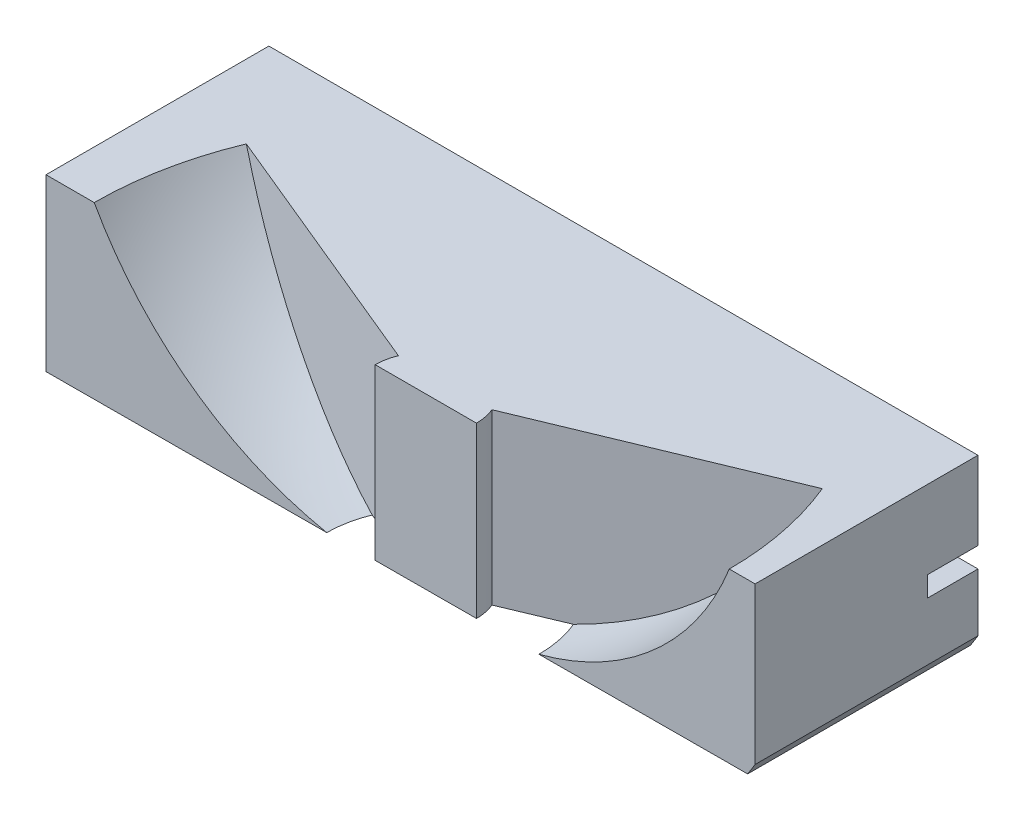
ISO-10303-21;
HEADER;
FILE_DESCRIPTION(('STEP AP214'),'2;1');
FILE_NAME('part.step','',(''),(''),'','','');
FILE_SCHEMA(('AUTOMOTIVE_DESIGN { 1 0 10303 214 1 1 1 1 }'));
ENDSEC;
DATA;
#1=APPLICATION_CONTEXT('core data for automotive mechanical design processes');
#2=APPLICATION_PROTOCOL_DEFINITION('international standard','automotive_design',2000,#1);
#3=PRODUCT_CONTEXT('',#1,'mechanical');
#4=PRODUCT('Part','Part','',(#3));
#5=PRODUCT_RELATED_PRODUCT_CATEGORY('part','',(#4));
#6=PRODUCT_DEFINITION_FORMATION('','',#4);
#7=PRODUCT_DEFINITION_CONTEXT('part definition',#1,'design');
#8=PRODUCT_DEFINITION('design','',#6,#7);
#9=PRODUCT_DEFINITION_SHAPE('','',#8);
#10=(LENGTH_UNIT() NAMED_UNIT(*) SI_UNIT(.MILLI.,.METRE.));
#11=(NAMED_UNIT(*) PLANE_ANGLE_UNIT() SI_UNIT($,.RADIAN.));
#12=(NAMED_UNIT(*) SI_UNIT($,.STERADIAN.) SOLID_ANGLE_UNIT());
#13=UNCERTAINTY_MEASURE_WITH_UNIT(LENGTH_MEASURE(1.E-05),#10,'distance_accuracy_value','');
#14=(GEOMETRIC_REPRESENTATION_CONTEXT(3) GLOBAL_UNCERTAINTY_ASSIGNED_CONTEXT((#13)) GLOBAL_UNIT_ASSIGNED_CONTEXT((#10,
#11,#12)) REPRESENTATION_CONTEXT('',''));
#15=CARTESIAN_POINT('',(0.,0.,0.));
#16=DIRECTION('',(0.,0.,1.));
#17=DIRECTION('',(1.,0.,0.));
#18=AXIS2_PLACEMENT_3D('',#15,#16,#17);
#19=CARTESIAN_POINT('',(-0.0573849535127821,16.6343068349976,0.));
#20=DIRECTION('',(0.00344977477050121,-0.999994049509312,0.));
#21=DIRECTION('',(0.999994049509312,0.00344977477050121,0.));
#22=AXIS2_PLACEMENT_3D('',#19,#20,#21);
#23=PLANE('',#22);
#24=DIRECTION('',(0.,0.,-1.));
#25=VECTOR('',#24,1.);
#26=CARTESIAN_POINT('',(-17.4999836629939,16.5741334399764,11.));
#27=LINE('',#26,#25);
#28=CARTESIAN_POINT('',(-17.4999836629939,16.5741334399764,0.));
#29=VERTEX_POINT('',#28);
#30=CARTESIAN_POINT('',(-17.4999836629939,16.5741334399764,-11.));
#31=VERTEX_POINT('',#30);
#32=EDGE_CURVE('E319',#29,#31,#27,.T.);
#33=ORIENTED_EDGE('',*,*,#32,.T.);
#34=DIRECTION('',(0.999994049509312,0.00344977477050121,0.));
#35=VECTOR('',#34,1.);
#36=CARTESIAN_POINT('',(-0.0530283972441789,16.6343218642249,-11.));
#37=LINE('',#36,#35);
#38=CARTESIAN_POINT('',(17.1297965112873,16.6935990928089,-11.));
#39=VERTEX_POINT('',#38);
#40=EDGE_CURVE('E190',#31,#39,#37,.T.);
#41=ORIENTED_EDGE('',*,*,#40,.T.);
#42=DIRECTION('',(0.,0.,1.));
#43=VECTOR('',#42,1.);
#44=CARTESIAN_POINT('',(17.1297965112873,16.6935990928089,-60.924766180902));
#45=LINE('',#44,#43);
#46=CARTESIAN_POINT('',(17.1297965112873,16.6935990928089,0.));
#47=VERTEX_POINT('',#46);
#48=EDGE_CURVE('E318',#39,#47,#45,.T.);
#49=ORIENTED_EDGE('',*,*,#48,.T.);
#50=DIRECTION('',(0.999994049509312,0.00344977477050121,0.));
#51=VECTOR('',#50,1.);
#52=CARTESIAN_POINT('',(-0.0530283972441789,16.6343218642249,0.));
#53=LINE('',#52,#51);
#54=CARTESIAN_POINT('',(6.82777060649413,16.6580592122778,0.));
#55=VERTEX_POINT('',#54);
#56=EDGE_CURVE('E175',#55,#47,#53,.T.);
#57=ORIENTED_EDGE('',*,*,#56,.F.);
#58=CARTESIAN_POINT('',(6.80962474678449,16.6579966127763,0.44690476985865));
#59=CARTESIAN_POINT('',(6.82236464578608,16.65804056282,0.290286915419516));
#60=CARTESIAN_POINT('',(6.82839702052645,16.658061373278,0.133200806205045));
#61=CARTESIAN_POINT('',(6.82704097165823,16.658056695187,-0.18090852850465));
#62=CARTESIAN_POINT('',(6.81965295811392,16.6580312080526,-0.337931755774619));
#63=CARTESIAN_POINT('',(6.77812994199541,16.6578879621468,-0.798769409113629));
#64=CARTESIAN_POINT('',(6.72532045909425,16.657705780241,-1.10111974995693));
#65=CARTESIAN_POINT('',(6.57508709752669,16.6571875058966,-1.67461766940396));
#66=CARTESIAN_POINT('',(6.48058193751898,16.6568614824399,-1.94654348884055));
#67=CARTESIAN_POINT('',(6.24760110178251,16.6560577462481,-2.47926027014327));
#68=CARTESIAN_POINT('',(6.10805314024972,16.6555763343465,-2.73958246318124));
#69=CARTESIAN_POINT('',(5.94828340197904,16.6550251614546,-2.98706014217391));
#70=B_SPLINE_CURVE_WITH_KNOTS('',3,(#58,#59,#60,#61,#62,#63,#64,#65,#66,#67,#68,#69),
.UNSPECIFIED.,.F.,.F.,(4,2,2,2,2,4),(0.,0.471108642622526,0.942202890611027,1.85834327293607,
2.71858587803662,3.60103931055067),.UNSPECIFIED.);
#71=CARTESIAN_POINT('',(6.39815124631617,16.6565771134289,-2.13350523914141));
#72=VERTEX_POINT('',#71);
#73=EDGE_CURVE('E297',#55,#72,#70,.T.);
#74=ORIENTED_EDGE('',*,*,#73,.T.);
#75=DIRECTION('',(-0.923874722162632,-0.00318717867289747,0.382681773332657));
#76=VECTOR('',#75,1.);
#77=CARTESIAN_POINT('',(3.19642231795104,16.6455318040248,-0.807304538283233));
#78=LINE('',#77,#76);
#79=CARTESIAN_POINT('',(3.55710431889961,16.6467445999911,-0.956704078544097));
#80=VERTEX_POINT('',#79);
#81=EDGE_CURVE('E281',#72,#80,#78,.T.);
#82=ORIENTED_EDGE('',*,*,#81,.T.);
#83=CARTESIAN_POINT('',(3.5571052287099,16.6467760862346,-0.95670450038757));
#84=CARTESIAN_POINT('',(3.74740357485177,16.6474325765744,-0.497278622709659));
#85=CARTESIAN_POINT('',(3.74740357485177,16.6474325765744,0.));
#86=B_SPLINE_CURVE_WITH_KNOTS('',2,(#83,#84,#85),.UNSPECIFIED.,.F.,.F.,(3,3),(0.,1.),.UNSPECIFIED.);
#87=CARTESIAN_POINT('',(3.74740357485177,16.6474325765744,0.));
#88=VERTEX_POINT('',#87);
#89=EDGE_CURVE('E274',#80,#88,#86,.T.);
#90=ORIENTED_EDGE('',*,*,#89,.T.);
#91=DIRECTION('',(0.999994049509312,0.00344977477050121,0.));
#92=VECTOR('',#91,1.);
#93=CARTESIAN_POINT('',(-0.0530283972441789,16.6343218642249,0.));
#94=LINE('',#93,#92);
#95=CARTESIAN_POINT('',(-1.25256449414034,16.6301837102375,0.));
#96=VERTEX_POINT('',#95);
#97=EDGE_CURVE('E178',#96,#88,#94,.T.);
#98=ORIENTED_EDGE('',*,*,#97,.F.);
#99=CARTESIAN_POINT('',(-1.25256667269479,16.6301837027219,0.));
#100=CARTESIAN_POINT('',(-1.25256667269479,16.6301837027219,-0.497278556436228));
#101=CARTESIAN_POINT('',(-1.06226837534537,16.6308401928934,-0.956704382590863));
#102=B_SPLINE_CURVE_WITH_KNOTS('',2,(#99,#100,#101),.UNSPECIFIED.,.F.,.F.,(3,3),(0.,1.),.UNSPECIFIED.);
#103=CARTESIAN_POINT('',(-1.06226742638805,16.6308176811921,-0.956704021692015));
#104=VERTEX_POINT('',#103);
#105=EDGE_CURVE('E271',#96,#104,#102,.T.);
#106=ORIENTED_EDGE('',*,*,#105,.T.);
#107=DIRECTION('',(-0.923874722162632,-0.00318717867289749,-0.382681773332657));
#108=VECTOR('',#107,1.);
#109=CARTESIAN_POINT('',(-0.171640886993569,16.6339126754155,-0.587794135861235));
#110=LINE('',#109,#108);
#111=CARTESIAN_POINT('',(-3.27502998855942,16.6232066182835,-1.87326111124126));
#112=VERTEX_POINT('',#111);
#113=EDGE_CURVE('E177',#104,#112,#110,.T.);
#114=ORIENTED_EDGE('',*,*,#113,.T.);
#115=CARTESIAN_POINT('',(-3.64014990689312,16.6219470293059,0.127401326466755));
#116=CARTESIAN_POINT('',(-3.64377015758628,16.6219345401821,-0.0138768940326821));
#117=CARTESIAN_POINT('',(-3.64136305428976,16.6219428441957,-0.155228514957291));
#118=CARTESIAN_POINT('',(-3.62452297030105,16.6220009390383,-0.437240287035578));
#119=CARTESIAN_POINT('',(-3.61008769921908,16.6220507377686,-0.577900301362626));
#120=CARTESIAN_POINT('',(-3.54976590862448,16.6222588355982,-0.990785072537782));
#121=CARTESIAN_POINT('',(-3.48702069452034,16.6224752937428,-1.26078388205942));
#122=CARTESIAN_POINT('',(-3.34612083236369,16.6229613694248,-1.69815580414729));
#123=CARTESIAN_POINT('',(-3.28016839681602,16.6231888918269,-1.86960999262592));
#124=CARTESIAN_POINT('',(-3.12856511824855,16.6237118921045,-2.20681124059305));
#125=CARTESIAN_POINT('',(-3.04262214711039,16.6240083777623,-2.37242698972255));
#126=CARTESIAN_POINT('',(-2.94756128857161,16.6243363182651,-2.53277808426929));
#127=B_SPLINE_CURVE_WITH_KNOTS('',3,(#115,#116,#117,#118,#119,#120,#121,#122,#123,#124,#125,
#126),.UNSPECIFIED.,.F.,.F.,(4,2,2,2,2,4),(0.,0.423683587060127,0.847447869899776,
1.67461972768066,2.22471103645234,2.78341131403662),.UNSPECIFIED.);
#128=CARTESIAN_POINT('',(-3.64178393435121,16.6219413922457,0.));
#129=VERTEX_POINT('',#128);
#130=EDGE_CURVE('E165',#129,#112,#127,.T.);
#131=ORIENTED_EDGE('',*,*,#130,.F.);
#132=EDGE_CURVE('E44',#29,#129,#53,.T.);
#133=ORIENTED_EDGE('',*,*,#132,.F.);
#134=EDGE_LOOP('',(#33,#41,#49,#57,#74,#82,#90,#98,#106,#114,#131,#133));
#135=FACE_BOUND('',#134,.T.);
#136=ADVANCED_FACE('F34',(#135),#23,.T.);
#137=CARTESIAN_POINT('',(-20.193762707854,21.1307270118031,-8.49999999999999));
#138=DIRECTION('',(0.,0.,1.));
#139=DIRECTION('',(0.999999965521372,0.000262597134505751,0.));
#140=AXIS2_PLACEMENT_3D('',#137,#138,#139);
#141=PLANE('',#140);
#142=DIRECTION('',(-0.00026259713450589,0.999999965521372,0.));
#143=VECTOR('',#142,1.);
#144=CARTESIAN_POINT('',(-17.5011803971233,21.1314340762267,-8.49999999999999));
#145=LINE('',#144,#143);
#146=CARTESIAN_POINT('',(-17.5009177999888,20.1314341107054,-8.49999999999999));
#147=VERTEX_POINT('',#146);
#148=CARTESIAN_POINT('',(-17.5011803971233,21.1314340762267,-8.49999999999999));
#149=VERTEX_POINT('',#148);
#150=EDGE_CURVE('E287',#147,#149,#145,.T.);
#151=ORIENTED_EDGE('',*,*,#150,.T.);
#152=DIRECTION('',(0.999999965521372,0.00026259713450589,0.));
#153=VECTOR('',#152,1.);
#154=CARTESIAN_POINT('',(-20.193762707854,21.1307270118031,-8.49999999999999));
#155=LINE('',#154,#153);
#156=CARTESIAN_POINT('',(17.4988183961247,21.1406249759345,-8.49999999999999));
#157=VERTEX_POINT('',#156);
#158=EDGE_CURVE('E356',#149,#157,#155,.T.);
#159=ORIENTED_EDGE('',*,*,#158,.T.);
#160=DIRECTION('',(0.000262597134505751,-0.999999965521372,0.));
#161=VECTOR('',#160,1.);
#162=CARTESIAN_POINT('',(17.4988183961247,21.1406249759345,-8.49999999999999));
#163=LINE('',#162,#161);
#164=CARTESIAN_POINT('',(17.4990809932592,20.1406250104131,-8.49999999999999));
#165=VERTEX_POINT('',#164);
#166=EDGE_CURVE('E358',#157,#165,#163,.T.);
#167=ORIENTED_EDGE('',*,*,#166,.T.);
#168=DIRECTION('',(0.999999965521372,0.00026259713450589,0.));
#169=VECTOR('',#168,1.);
#170=CARTESIAN_POINT('',(-20.1935001107195,20.1307270462818,-8.49999999999999));
#171=LINE('',#170,#169);
#172=EDGE_CURVE('E347',#147,#165,#171,.T.);
#173=ORIENTED_EDGE('',*,*,#172,.F.);
#174=EDGE_LOOP('',(#151,#159,#167,#173));
#175=FACE_BOUND('',#174,.T.);
#176=ADVANCED_FACE('F229',(#175),#141,.F.);
#177=CARTESIAN_POINT('',(-20.193762707854,21.1307270118031,-11.));
#178=DIRECTION('',(-0.00026259713450589,0.999999965521372,0.));
#179=DIRECTION('',(-0.999999965521372,-0.00026259713450589,0.));
#180=AXIS2_PLACEMENT_3D('',#177,#178,#179);
#181=PLANE('',#180);
#182=DIRECTION('',(0.,0.,-1.));
#183=VECTOR('',#182,1.);
#184=CARTESIAN_POINT('',(-17.5011803971233,21.1314340762267,-11.));
#185=LINE('',#184,#183);
#186=CARTESIAN_POINT('',(-17.5011803971233,21.1314340762267,-11.));
#187=VERTEX_POINT('',#186);
#188=EDGE_CURVE('E294',#149,#187,#185,.T.);
#189=ORIENTED_EDGE('',*,*,#188,.T.);
#190=DIRECTION('',(0.999999965521372,0.00026259713450589,0.));
#191=VECTOR('',#190,1.);
#192=CARTESIAN_POINT('',(-20.193762707854,21.1307270118031,-11.));
#193=LINE('',#192,#191);
#194=CARTESIAN_POINT('',(17.4988183961247,21.1406249759345,-11.));
#195=VERTEX_POINT('',#194);
#196=EDGE_CURVE('E353',#187,#195,#193,.T.);
#197=ORIENTED_EDGE('',*,*,#196,.T.);
#198=DIRECTION('',(0.,0.,1.));
#199=VECTOR('',#198,1.);
#200=CARTESIAN_POINT('',(17.4988183961247,21.1406249759345,-11.));
#201=LINE('',#200,#199);
#202=EDGE_CURVE('E355',#195,#157,#201,.T.);
#203=ORIENTED_EDGE('',*,*,#202,.T.);
#204=ORIENTED_EDGE('',*,*,#158,.F.);
#205=EDGE_LOOP('',(#189,#197,#203,#204));
#206=FACE_BOUND('',#205,.T.);
#207=ADVANCED_FACE('F226',(#206),#181,.F.);
#208=CARTESIAN_POINT('',(0.00437030292414028,-0.00396974504120269,-11.));
#209=DIRECTION('',(0.,0.,1.));
#210=DIRECTION('',(0.999999965521372,0.000262597134505751,0.));
#211=AXIS2_PLACEMENT_3D('',#208,#209,#210);
#212=PLANE('',#211);
#213=DIRECTION('',(-0.00026259713450589,0.999999965521372,0.));
#214=VECTOR('',#213,1.);
#215=CARTESIAN_POINT('',(17.4978047711855,25.0006248428469,-11.));
#216=LINE('',#215,#214);
#217=CARTESIAN_POINT('',(17.4978047711855,25.0006248428469,-11.));
#218=VERTEX_POINT('',#217);
#219=EDGE_CURVE('E341',#195,#218,#216,.T.);
#220=ORIENTED_EDGE('',*,*,#219,.F.);
#221=ORIENTED_EDGE('',*,*,#196,.F.);
#222=DIRECTION('',(0.00026259713450589,-0.999999965521372,0.));
#223=VECTOR('',#222,1.);
#224=CARTESIAN_POINT('',(-17.5021940220625,24.9914339431392,-11.));
#225=LINE('',#224,#223);
#226=CARTESIAN_POINT('',(-17.5021940220625,24.9914339431392,-11.));
#227=VERTEX_POINT('',#226);
#228=EDGE_CURVE('E321',#227,#187,#225,.T.);
#229=ORIENTED_EDGE('',*,*,#228,.F.);
#230=DIRECTION('',(-0.999999965521372,-0.000262597134505751,0.));
#231=VECTOR('',#230,1.);
#232=CARTESIAN_POINT('',(-17.5021940220625,24.9914339431392,-11.));
#233=LINE('',#232,#231);
#234=EDGE_CURVE('E342',#218,#227,#233,.T.);
#235=ORIENTED_EDGE('',*,*,#234,.F.);
#236=EDGE_LOOP('',(#220,#221,#229,#235));
#237=FACE_BOUND('',#236,.T.);
#238=ADVANCED_FACE('F216',(#237),#212,.F.);
#239=CARTESIAN_POINT('',(17.4978047711855,25.0006248428469,11.));
#240=DIRECTION('',(-0.999999965521372,-0.00026259713450589,0.));
#241=DIRECTION('',(0.00026259713450589,-0.999999965521372,0.));
#242=AXIS2_PLACEMENT_3D('',#239,#240,#241);
#243=PLANE('',#242);
#244=ORIENTED_EDGE('',*,*,#166,.F.);
#245=ORIENTED_EDGE('',*,*,#202,.F.);
#246=ORIENTED_EDGE('',*,*,#219,.T.);
#247=DIRECTION('',(0.,0.,-1.));
#248=VECTOR('',#247,1.);
#249=CARTESIAN_POINT('',(17.4978047711855,25.0006248428469,11.));
#250=LINE('',#249,#248);
#251=CARTESIAN_POINT('',(17.4978047711855,25.0006248428469,0.));
#252=VERTEX_POINT('',#251);
#253=EDGE_CURVE('E345',#252,#218,#250,.T.);
#254=ORIENTED_EDGE('',*,*,#253,.F.);
#255=DIRECTION('',(-0.00026259713450589,0.999999965521372,0.));
#256=VECTOR('',#255,1.);
#257=CARTESIAN_POINT('',(17.4978047711855,25.0006248428469,0.));
#258=LINE('',#257,#256);
#259=CARTESIAN_POINT('',(17.4998313046134,17.2833534346678,0.));
#260=VERTEX_POINT('',#259);
#261=EDGE_CURVE('E310',#260,#252,#258,.T.);
#262=ORIENTED_EDGE('',*,*,#261,.F.);
#263=DIRECTION('',(0.,0.,1.));
#264=VECTOR('',#263,1.);
#265=CARTESIAN_POINT('',(17.4998313046134,17.2833534346678,-60.924766180902));
#266=LINE('',#265,#264);
#267=CARTESIAN_POINT('',(17.4998313046134,17.2833534346678,-11.));
#268=VERTEX_POINT('',#267);
#269=EDGE_CURVE('E328',#268,#260,#266,.T.);
#270=ORIENTED_EDGE('',*,*,#269,.F.);
#271=CARTESIAN_POINT('',(17.4990809932592,20.1406250104131,-11.));
#272=VERTEX_POINT('',#271);
#273=EDGE_CURVE('E337',#268,#272,#216,.T.);
#274=ORIENTED_EDGE('',*,*,#273,.T.);
#275=DIRECTION('',(0.,0.,-1.));
#276=VECTOR('',#275,1.);
#277=CARTESIAN_POINT('',(17.4990809932592,20.1406250104131,-11.));
#278=LINE('',#277,#276);
#279=EDGE_CURVE('E349',#165,#272,#278,.T.);
#280=ORIENTED_EDGE('',*,*,#279,.F.);
#281=EDGE_LOOP('',(#244,#245,#246,#254,#262,#270,#274,#280));
#282=FACE_BOUND('',#281,.T.);
#283=ADVANCED_FACE('F225',(#282),#243,.F.);
#284=CARTESIAN_POINT('',(-20.1935001107195,20.1307270462818,-11.));
#285=DIRECTION('',(0.00026259713450589,-0.999999965521372,0.));
#286=DIRECTION('',(0.999999965521372,0.00026259713450589,0.));
#287=AXIS2_PLACEMENT_3D('',#284,#285,#286);
#288=PLANE('',#287);
#289=DIRECTION('',(0.,0.,1.));
#290=VECTOR('',#289,1.);
#291=CARTESIAN_POINT('',(-17.5009177999888,20.1314341107054,-11.));
#292=LINE('',#291,#290);
#293=CARTESIAN_POINT('',(-17.5009177999888,20.1314341107054,-11.));
#294=VERTEX_POINT('',#293);
#295=EDGE_CURVE('E340',#294,#147,#292,.T.);
#296=ORIENTED_EDGE('',*,*,#295,.T.);
#297=ORIENTED_EDGE('',*,*,#172,.T.);
#298=ORIENTED_EDGE('',*,*,#279,.T.);
#299=DIRECTION('',(0.999999965521372,0.00026259713450589,0.));
#300=VECTOR('',#299,1.);
#301=CARTESIAN_POINT('',(-20.1935001107195,20.1307270462818,-11.));
#302=LINE('',#301,#300);
#303=EDGE_CURVE('E329',#294,#272,#302,.T.);
#304=ORIENTED_EDGE('',*,*,#303,.F.);
#305=EDGE_LOOP('',(#296,#297,#298,#304));
#306=FACE_BOUND('',#305,.T.);
#307=ADVANCED_FACE('F220',(#306),#288,.F.);
#308=CARTESIAN_POINT('',(-17.5021940220625,24.9914339431392,11.));
#309=DIRECTION('',(0.000262597134505751,-0.999999965521372,0.));
#310=DIRECTION('',(0.,0.,-1.));
#311=AXIS2_PLACEMENT_3D('',#308,#309,#310);
#312=PLANE('',#311);
#313=DIRECTION('',(-0.999999965521372,-0.000262597134505751,0.));
#314=VECTOR('',#313,1.);
#315=CARTESIAN_POINT('',(-17.5021940220625,24.9914339431392,0.));
#316=LINE('',#315,#314);
#317=CARTESIAN_POINT('',(16.2233342060075,25.000290170517,0.));
#318=VERTEX_POINT('',#317);
#319=EDGE_CURVE('E46',#252,#318,#316,.T.);
#320=ORIENTED_EDGE('',*,*,#319,.F.);
#321=ORIENTED_EDGE('',*,*,#253,.T.);
#322=ORIENTED_EDGE('',*,*,#234,.T.);
#323=DIRECTION('',(0.,0.,-1.));
#324=VECTOR('',#323,1.);
#325=CARTESIAN_POINT('',(-17.5021940220625,24.9914339431392,11.));
#326=LINE('',#325,#324);
#327=CARTESIAN_POINT('',(-17.5021940220625,24.9914339431392,0.));
#328=VERTEX_POINT('',#327);
#329=EDGE_CURVE('E325',#328,#227,#326,.T.);
#330=ORIENTED_EDGE('',*,*,#329,.F.);
#331=CARTESIAN_POINT('',(-15.1214705567651,24.9920591143208,0.));
#332=VERTEX_POINT('',#331);
#333=EDGE_CURVE('E11',#332,#328,#316,.T.);
#334=ORIENTED_EDGE('',*,*,#333,.F.);
#335=CARTESIAN_POINT('',(1.24522378263055,24.9963569615039,0.));
#336=DIRECTION('',(0.000262597134505751,-0.999999965521372,0.));
#337=DIRECTION('',(0.,0.,-1.));
#338=AXIS2_PLACEMENT_3D('',#335,#336,#337);
#339=CIRCLE('',#338,16.3666949036968);
#340=CARTESIAN_POINT('',(-13.8756301324054,24.9923862684576,-6.26326298221892));
#341=VERTEX_POINT('',#340);
#342=EDGE_CURVE('E167',#332,#341,#339,.T.);
#343=ORIENTED_EDGE('',*,*,#342,.T.);
#344=DIRECTION('',(-0.923879500657188,-0.000242608117865983,-0.38268343236509));
#345=VECTOR('',#344,1.);
#346=CARTESIAN_POINT('',(-1.06446122517136,24.9957504448183,-0.956702888027165));
#347=LINE('',#346,#345);
#348=CARTESIAN_POINT('',(-1.06446122517136,24.9957504448183,-0.956702888027166));
#349=VERTEX_POINT('',#348);
#350=EDGE_CURVE('E331',#349,#341,#347,.T.);
#351=ORIENTED_EDGE('',*,*,#350,.F.);
#352=CARTESIAN_POINT('',(1.24522378263055,24.9963569615039,0.));
#353=DIRECTION('',(0.000262597134505751,-0.999999965521372,0.));
#354=DIRECTION('',(0.,0.,-1.));
#355=AXIS2_PLACEMENT_3D('',#352,#353,#354);
#356=CIRCLE('',#355,2.49998512377313);
#357=CARTESIAN_POINT('',(-1.25476125494651,24.9957004725741,0.));
#358=VERTEX_POINT('',#357);
#359=EDGE_CURVE('E268',#358,#349,#356,.T.);
#360=ORIENTED_EDGE('',*,*,#359,.F.);
#361=CARTESIAN_POINT('',(3.74520882020793,24.9970134504337,0.));
#362=VERTEX_POINT('',#361);
#363=EDGE_CURVE('E47',#362,#358,#316,.T.);
#364=ORIENTED_EDGE('',*,*,#363,.F.);
#365=CARTESIAN_POINT('',(1.24522378263055,24.9963569615039,0.));
#366=DIRECTION('',(0.000262597134505751,-0.999999965521372,0.));
#367=DIRECTION('',(0.,0.,-1.));
#368=AXIS2_PLACEMENT_3D('',#365,#366,#367);
#369=CIRCLE('',#368,2.49998512377344);
#370=CARTESIAN_POINT('',(3.55490879043275,24.9969634781894,-0.956702888027284));
#371=VERTEX_POINT('',#370);
#372=EDGE_CURVE('E306',#371,#362,#369,.T.);
#373=ORIENTED_EDGE('',*,*,#372,.F.);
#374=DIRECTION('',(-0.923879500657188,-0.000242608117865971,0.38268343236509));
#375=VECTOR('',#374,1.);
#376=CARTESIAN_POINT('',(3.55490879043275,24.9969634781894,-0.956702888027284));
#377=LINE('',#376,#375);
#378=CARTESIAN_POINT('',(15.0831934384824,24.9999907728082,-5.73187490478839));
#379=VERTEX_POINT('',#378);
#380=EDGE_CURVE('E305',#379,#371,#377,.T.);
#381=ORIENTED_EDGE('',*,*,#380,.F.);
#382=CARTESIAN_POINT('',(1.24522378263055,24.9963569615039,0.));
#383=DIRECTION('',(0.000262597134505751,-0.999999965521372,0.));
#384=DIRECTION('',(0.,0.,-1.));
#385=AXIS2_PLACEMENT_3D('',#382,#383,#384);
#386=CIRCLE('',#385,14.9781109398016);
#387=EDGE_CURVE('E352',#379,#318,#386,.T.);
#388=ORIENTED_EDGE('',*,*,#387,.T.);
#389=EDGE_LOOP('',(#320,#321,#322,#330,#334,#343,#351,#360,#364,#373,#381,#388));
#390=FACE_BOUND('',#389,.T.);
#391=ADVANCED_FACE('F214',(#390),#312,.F.);
#392=ORIENTED_EDGE('',*,*,#40,.F.);
#393=EDGE_CURVE('E324',#294,#31,#225,.T.);
#394=ORIENTED_EDGE('',*,*,#393,.F.);
#395=ORIENTED_EDGE('',*,*,#303,.T.);
#396=ORIENTED_EDGE('',*,*,#273,.F.);
#397=DIRECTION('',(0.531483705868581,0.847068515762568,0.));
#398=VECTOR('',#397,1.);
#399=CARTESIAN_POINT('',(-9.03436843983486,-25.0063441539822,-11.));
#400=LINE('',#399,#398);
#401=EDGE_CURVE('E326',#39,#268,#400,.T.);
#402=ORIENTED_EDGE('',*,*,#401,.F.);
#403=EDGE_LOOP('',(#392,#394,#395,#396,#402));
#404=FACE_BOUND('',#403,.T.);
#405=ADVANCED_FACE('F209',(#404),#212,.F.);
#406=CARTESIAN_POINT('',(-9.03436843983486,-25.0063441539822,-60.924766180902));
#407=DIRECTION('',(-0.847068515762568,0.531483705868581,0.));
#408=DIRECTION('',(-0.531483705868581,-0.847068515762568,0.));
#409=AXIS2_PLACEMENT_3D('',#406,#407,#408);
#410=PLANE('',#409);
#411=ORIENTED_EDGE('',*,*,#48,.F.);
#412=ORIENTED_EDGE('',*,*,#401,.T.);
#413=ORIENTED_EDGE('',*,*,#269,.T.);
#414=DIRECTION('',(0.531483705868581,0.847068515762568,0.));
#415=VECTOR('',#414,1.);
#416=CARTESIAN_POINT('',(-9.03436843983486,-25.0063441539822,0.));
#417=LINE('',#416,#415);
#418=EDGE_CURVE('E308',#47,#260,#417,.T.);
#419=ORIENTED_EDGE('',*,*,#418,.F.);
#420=EDGE_LOOP('',(#411,#412,#413,#419));
#421=FACE_BOUND('',#420,.T.);
#422=ADVANCED_FACE('F205',(#421),#410,.F.);
#423=CARTESIAN_POINT('',(-17.5021940220625,24.9914339431392,11.));
#424=DIRECTION('',(0.999999965521372,0.00026259713450589,0.));
#425=DIRECTION('',(-0.00026259713450589,0.999999965521372,0.));
#426=AXIS2_PLACEMENT_3D('',#423,#424,#425);
#427=PLANE('',#426);
#428=ORIENTED_EDGE('',*,*,#32,.F.);
#429=DIRECTION('',(0.00026259713450589,-0.999999965521372,0.));
#430=VECTOR('',#429,1.);
#431=CARTESIAN_POINT('',(-17.5021940220625,24.9914339431392,0.));
#432=LINE('',#431,#430);
#433=EDGE_CURVE('E54',#328,#29,#432,.T.);
#434=ORIENTED_EDGE('',*,*,#433,.F.);
#435=ORIENTED_EDGE('',*,*,#329,.T.);
#436=ORIENTED_EDGE('',*,*,#228,.T.);
#437=ORIENTED_EDGE('',*,*,#188,.F.);
#438=ORIENTED_EDGE('',*,*,#150,.F.);
#439=ORIENTED_EDGE('',*,*,#295,.F.);
#440=ORIENTED_EDGE('',*,*,#393,.T.);
#441=EDGE_LOOP('',(#428,#434,#435,#436,#437,#438,#439,#440));
#442=FACE_BOUND('',#441,.T.);
#443=ADVANCED_FACE('F201',(#442),#427,.F.);
#444=CARTESIAN_POINT('',(1.24741940765414,16.6351653894345,0.));
#445=DIRECTION('',(0.000262597134505751,-0.999999965521372,0.));
#446=DIRECTION('',(0.,0.,-1.));
#447=AXIS2_PLACEMENT_3D('',#444,#445,#446);
#448=CYLINDRICAL_SURFACE('',#447,2.49998512377344);
#449=DIRECTION('',(0.000262597134505751,-0.999999965521372,0.));
#450=VECTOR('',#449,1.);
#451=CARTESIAN_POINT('',(3.74740444523151,16.6358218783643,0.));
#452=LINE('',#451,#450);
#453=EDGE_CURVE('E181',#88,#362,#452,.F.);
#454=ORIENTED_EDGE('',*,*,#453,.F.);
#455=ORIENTED_EDGE('',*,*,#89,.F.);
#456=DIRECTION('',(0.000262597134505703,-0.999999965521372,0.));
#457=VECTOR('',#456,1.);
#458=CARTESIAN_POINT('',(3.55710215070391,16.644396342749,-0.956702888027284));
#459=LINE('',#458,#457);
#460=EDGE_CURVE('E269',#371,#80,#459,.T.);
#461=ORIENTED_EDGE('',*,*,#460,.F.);
#462=ORIENTED_EDGE('',*,*,#372,.T.);
#463=EDGE_LOOP('',(#454,#455,#461,#462));
#464=FACE_BOUND('',#463,.T.);
#465=ADVANCED_FACE('F204',(#464),#448,.T.);
#466=CARTESIAN_POINT('',(3.15635390866507,30.0776015058554,-0.792168683916493));
#467=DIRECTION('',(-0.382683419170691,-0.000100491572761913,-0.923879532511286));
#468=DIRECTION('',(-0.923879500657188,-0.000242608117865971,0.38268343236509));
#469=AXIS2_PLACEMENT_3D('',#466,#467,#468);
#470=PLANE('',#469);
#471=ORIENTED_EDGE('',*,*,#81,.F.);
#472=CARTESIAN_POINT('',(3.15635390866507,30.0776015058554,-0.792168683916493));
#473=DIRECTION('',(0.382683419170691,0.000100491572761913,0.923879532511286));
#474=DIRECTION('',(-0.923879500657188,-0.000242608117865971,0.38268343236509));
#475=AXIS2_PLACEMENT_3D('',#472,#473,#474);
#476=CIRCLE('',#475,13.8719980347061);
#477=EDGE_CURVE('E303',#72,#379,#476,.T.);
#478=ORIENTED_EDGE('',*,*,#477,.T.);
#479=ORIENTED_EDGE('',*,*,#380,.T.);
#480=ORIENTED_EDGE('',*,*,#460,.T.);
#481=EDGE_LOOP('',(#471,#478,#479,#480));
#482=FACE_BOUND('',#481,.T.);
#483=ADVANCED_FACE('F248',(#482),#470,.F.);
#484=CARTESIAN_POINT('',(1.24388959420578,30.0770992981893,0.));
#485=DIRECTION('',(0.000262597134505751,-0.999999965521372,0.));
#486=DIRECTION('',(0.,0.,-1.));
#487=AXIS2_PLACEMENT_3D('',#484,#485,#486);
#488=DEGENERATE_TOROIDAL_SURFACE('',#487,2.0700365286803,13.8719980347061,.T.);
#489=ORIENTED_EDGE('',*,*,#73,.F.);
#490=CARTESIAN_POINT('',(3.31392605151405,30.07764288385,0.));
#491=DIRECTION('',(0.,0.,1.));
#492=DIRECTION('',(0.999999965521372,0.000262597134505751,0.));
#493=AXIS2_PLACEMENT_3D('',#490,#491,#492);
#494=CIRCLE('',#493,13.8719980347061);
#495=EDGE_CURVE('E311',#318,#55,#494,.F.);
#496=ORIENTED_EDGE('',*,*,#495,.F.);
#497=ORIENTED_EDGE('',*,*,#387,.F.);
#498=ORIENTED_EDGE('',*,*,#477,.F.);
#499=EDGE_LOOP('',(#489,#496,#497,#498));
#500=FACE_BOUND('',#499,.T.);
#501=ADVANCED_FACE('F198',(#500),#488,.F.);
#502=CARTESIAN_POINT('',(1.24741940765414,16.6351653894345,0.));
#503=DIRECTION('',(0.000262597134505751,-0.999999965521372,0.));
#504=DIRECTION('',(0.,0.,-1.));
#505=AXIS2_PLACEMENT_3D('',#502,#503,#504);
#506=CYLINDRICAL_SURFACE('',#505,2.49998512377312);
#507=ORIENTED_EDGE('',*,*,#105,.F.);
#508=DIRECTION('',(0.000262597134505751,-0.999999965521372,0.));
#509=VECTOR('',#508,1.);
#510=CARTESIAN_POINT('',(-1.25256562992293,16.6345089005047,0.));
#511=LINE('',#510,#509);
#512=EDGE_CURVE('E263',#96,#358,#511,.F.);
#513=ORIENTED_EDGE('',*,*,#512,.T.);
#514=ORIENTED_EDGE('',*,*,#359,.T.);
#515=DIRECTION('',(-0.000262597134505919,0.999999965521372,0.));
#516=VECTOR('',#515,1.);
#517=CARTESIAN_POINT('',(-1.06226333539535,16.62593443612,-0.956702888027164));
#518=LINE('',#517,#516);
#519=EDGE_CURVE('E151',#104,#349,#518,.T.);
#520=ORIENTED_EDGE('',*,*,#519,.F.);
#521=EDGE_LOOP('',(#507,#513,#514,#520));
#522=FACE_BOUND('',#521,.T.);
#523=ADVANCED_FACE('F212',(#522),#506,.T.);
#524=CARTESIAN_POINT('',(-0.221074177811073,33.2053568551074,-0.606467577208565));
#525=DIRECTION('',(0.382683419170691,0.000100491572761884,-0.923879532511286));
#526=DIRECTION('',(-0.923879500657188,-0.000242608117865983,-0.38268343236509));
#527=AXIS2_PLACEMENT_3D('',#524,#525,#526);
#528=PLANE('',#527);
#529=ORIENTED_EDGE('',*,*,#113,.F.);
#530=ORIENTED_EDGE('',*,*,#519,.T.);
#531=ORIENTED_EDGE('',*,*,#350,.T.);
#532=CARTESIAN_POINT('',(-0.221074177811073,33.2053568551074,-0.606467577208565));
#533=DIRECTION('',(-0.382683419170691,-0.000100491572761884,0.923879532511286));
#534=DIRECTION('',(-0.923879500657188,-0.000242608117865983,-0.38268343236509));
#535=AXIS2_PLACEMENT_3D('',#532,#533,#534);
#536=CIRCLE('',#535,16.9085516360352);
#537=EDGE_CURVE('E157',#341,#112,#536,.T.);
#538=ORIENTED_EDGE('',*,*,#537,.T.);
#539=EDGE_LOOP('',(#529,#530,#531,#538));
#540=FACE_BOUND('',#539,.T.);
#541=ADVANCED_FACE('F197',(#540),#528,.F.);
#542=CARTESIAN_POINT('',(1.24306802174378,33.2057413346668,0.));
#543=DIRECTION('',(0.000262597134505751,-0.999999965521372,0.));
#544=DIRECTION('',(0.,0.,-1.));
#545=AXIS2_PLACEMENT_3D('',#542,#543,#544);
#546=DEGENERATE_TOROIDAL_SURFACE('',#545,1.58477615155803,16.9085516360352,.T.);
#547=CARTESIAN_POINT('',(-0.341708075173342,33.2053251769905,0.));
#548=DIRECTION('',(0.,0.,1.));
#549=DIRECTION('',(0.999999965521372,0.000262597134505751,0.));
#550=AXIS2_PLACEMENT_3D('',#547,#548,#549);
#551=CIRCLE('',#550,16.9085516360352);
#552=EDGE_CURVE('E162',#332,#129,#551,.T.);
#553=ORIENTED_EDGE('',*,*,#552,.T.);
#554=ORIENTED_EDGE('',*,*,#130,.T.);
#555=ORIENTED_EDGE('',*,*,#537,.F.);
#556=ORIENTED_EDGE('',*,*,#342,.F.);
#557=EDGE_LOOP('',(#553,#554,#555,#556));
#558=FACE_BOUND('',#557,.T.);
#559=ADVANCED_FACE('F163',(#558),#546,.F.);
#560=CARTESIAN_POINT('',(0.00437030292414028,-0.00396974504120252,0.));
#561=DIRECTION('',(0.,0.,1.));
#562=DIRECTION('',(0.999999965521372,0.000262597134505751,0.));
#563=AXIS2_PLACEMENT_3D('',#560,#561,#562);
#564=PLANE('',#563);
#565=ORIENTED_EDGE('',*,*,#512,.F.);
#566=ORIENTED_EDGE('',*,*,#97,.T.);
#567=ORIENTED_EDGE('',*,*,#453,.T.);
#568=ORIENTED_EDGE('',*,*,#363,.T.);
#569=EDGE_LOOP('',(#565,#566,#567,#568));
#570=FACE_BOUND('',#569,.T.);
#571=ADVANCED_FACE('F196',(#570),#564,.T.);
#572=ORIENTED_EDGE('',*,*,#495,.T.);
#573=ORIENTED_EDGE('',*,*,#56,.T.);
#574=ORIENTED_EDGE('',*,*,#418,.T.);
#575=ORIENTED_EDGE('',*,*,#261,.T.);
#576=ORIENTED_EDGE('',*,*,#319,.T.);
#577=EDGE_LOOP('',(#572,#573,#574,#575,#576));
#578=FACE_BOUND('',#577,.T.);
#579=ADVANCED_FACE('F252',(#578),#564,.T.);
#580=ORIENTED_EDGE('',*,*,#433,.T.);
#581=ORIENTED_EDGE('',*,*,#132,.T.);
#582=ORIENTED_EDGE('',*,*,#552,.F.);
#583=ORIENTED_EDGE('',*,*,#333,.T.);
#584=EDGE_LOOP('',(#580,#581,#582,#583));
#585=FACE_BOUND('',#584,.T.);
#586=ADVANCED_FACE('F171',(#585),#564,.T.);
#587=CLOSED_SHELL('',(#136,#176,#207,#238,#283,#307,#391,#405,#422,#443,#465,#483,#501,#523,
#541,#559,#571,#579,#586));
#588=MANIFOLD_SOLID_BREP('B2',#587);
#589=ADVANCED_BREP_SHAPE_REPRESENTATION('',(#18,#588),#14);
#590=SHAPE_DEFINITION_REPRESENTATION(#9,#589);
ENDSEC;
END-ISO-10303-21;
